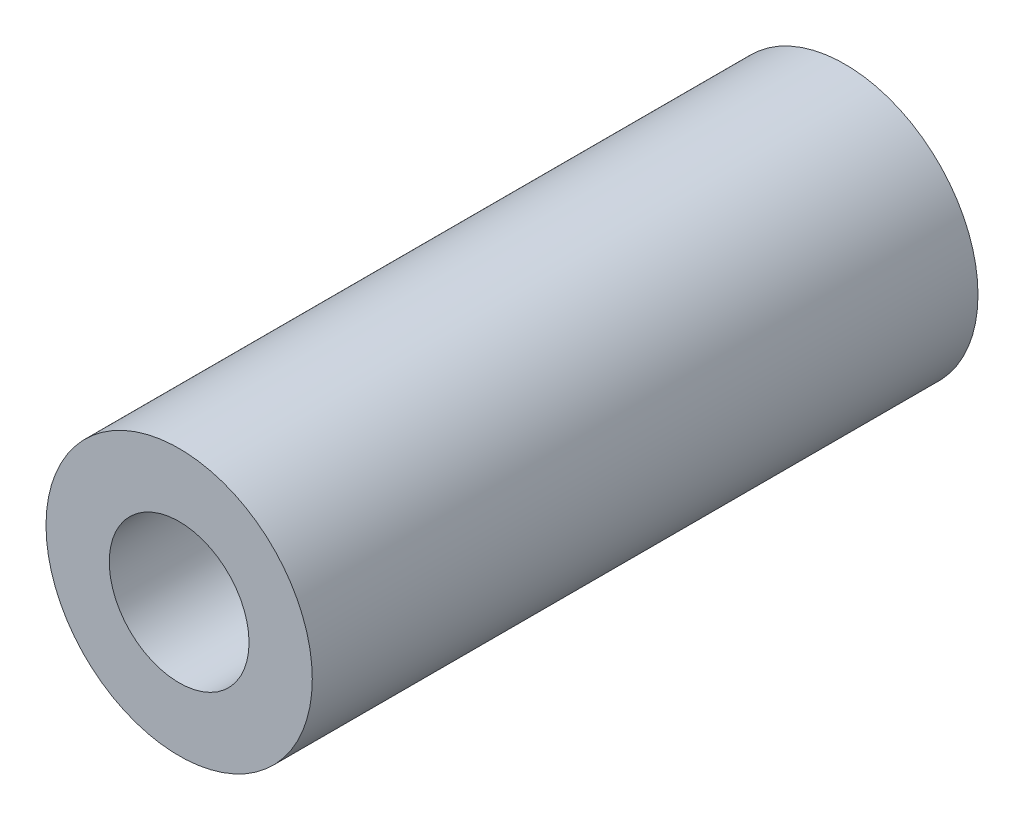
ISO-10303-21;
HEADER;
FILE_DESCRIPTION(('STEP AP214'),'2;1');
FILE_NAME('part.step','',(''),(''),'','','');
FILE_SCHEMA(('AUTOMOTIVE_DESIGN { 1 0 10303 214 1 1 1 1 }'));
ENDSEC;
DATA;
#1=APPLICATION_CONTEXT('core data for automotive mechanical design processes');
#2=APPLICATION_PROTOCOL_DEFINITION('international standard','automotive_design',2000,#1);
#3=PRODUCT_CONTEXT('',#1,'mechanical');
#4=PRODUCT('Part','Part','',(#3));
#5=PRODUCT_RELATED_PRODUCT_CATEGORY('part','',(#4));
#6=PRODUCT_DEFINITION_FORMATION('','',#4);
#7=PRODUCT_DEFINITION_CONTEXT('part definition',#1,'design');
#8=PRODUCT_DEFINITION('design','',#6,#7);
#9=PRODUCT_DEFINITION_SHAPE('','',#8);
#10=(LENGTH_UNIT() NAMED_UNIT(*) SI_UNIT(.MILLI.,.METRE.));
#11=(NAMED_UNIT(*) PLANE_ANGLE_UNIT() SI_UNIT($,.RADIAN.));
#12=(NAMED_UNIT(*) SI_UNIT($,.STERADIAN.) SOLID_ANGLE_UNIT());
#13=UNCERTAINTY_MEASURE_WITH_UNIT(LENGTH_MEASURE(1.E-05),#10,'distance_accuracy_value','');
#14=(GEOMETRIC_REPRESENTATION_CONTEXT(3) GLOBAL_UNCERTAINTY_ASSIGNED_CONTEXT((#13)) GLOBAL_UNIT_ASSIGNED_CONTEXT((#10,
#11,#12)) REPRESENTATION_CONTEXT('',''));
#15=CARTESIAN_POINT('',(0.,0.,0.));
#16=DIRECTION('',(0.,0.,1.));
#17=DIRECTION('',(1.,0.,0.));
#18=AXIS2_PLACEMENT_3D('',#15,#16,#17);
#19=CARTESIAN_POINT('',(0.,0.,10.));
#20=DIRECTION('',(0.,0.,1.));
#21=DIRECTION('',(1.,0.,0.));
#22=AXIS2_PLACEMENT_3D('',#19,#20,#21);
#23=PLANE('',#22);
#24=CARTESIAN_POINT('',(0.,0.,10.));
#25=DIRECTION('',(0.,0.,1.));
#26=DIRECTION('',(1.,0.,0.));
#27=AXIS2_PLACEMENT_3D('',#24,#25,#26);
#28=CIRCLE('',#27,4.);
#29=CARTESIAN_POINT('',(4.,0.,10.));
#30=VERTEX_POINT('',#29);
#31=EDGE_CURVE('E10',#30,#30,#28,.T.);
#32=ORIENTED_EDGE('',*,*,#31,.T.);
#33=EDGE_LOOP('',(#32));
#34=FACE_BOUND('',#33,.T.);
#35=CARTESIAN_POINT('',(0.,0.,10.));
#36=DIRECTION('',(0.,0.,1.));
#37=DIRECTION('',(1.,0.,0.));
#38=AXIS2_PLACEMENT_3D('',#35,#36,#37);
#39=CIRCLE('',#38,2.1);
#40=CARTESIAN_POINT('',(2.1,0.,10.));
#41=VERTEX_POINT('',#40);
#42=EDGE_CURVE('E41',#41,#41,#39,.T.);
#43=ORIENTED_EDGE('',*,*,#42,.F.);
#44=EDGE_LOOP('',(#43));
#45=FACE_BOUND('',#44,.T.);
#46=ADVANCED_FACE('F30',(#34,#45),#23,.T.);
#47=CARTESIAN_POINT('',(0.,0.,-10.));
#48=DIRECTION('',(0.,0.,1.));
#49=DIRECTION('',(1.,0.,0.));
#50=AXIS2_PLACEMENT_3D('',#47,#48,#49);
#51=PLANE('',#50);
#52=CARTESIAN_POINT('',(0.,0.,-10.));
#53=DIRECTION('',(0.,0.,1.));
#54=DIRECTION('',(1.,0.,0.));
#55=AXIS2_PLACEMENT_3D('',#52,#53,#54);
#56=CIRCLE('',#55,4.);
#57=CARTESIAN_POINT('',(4.,0.,-10.));
#58=VERTEX_POINT('',#57);
#59=EDGE_CURVE('E34',#58,#58,#56,.T.);
#60=ORIENTED_EDGE('',*,*,#59,.F.);
#61=EDGE_LOOP('',(#60));
#62=FACE_BOUND('',#61,.T.);
#63=CARTESIAN_POINT('',(0.,0.,-10.));
#64=DIRECTION('',(0.,0.,1.));
#65=DIRECTION('',(1.,0.,0.));
#66=AXIS2_PLACEMENT_3D('',#63,#64,#65);
#67=CIRCLE('',#66,2.1);
#68=CARTESIAN_POINT('',(2.1,0.,-10.));
#69=VERTEX_POINT('',#68);
#70=EDGE_CURVE('E43',#69,#69,#67,.T.);
#71=ORIENTED_EDGE('',*,*,#70,.T.);
#72=EDGE_LOOP('',(#71));
#73=FACE_BOUND('',#72,.T.);
#74=ADVANCED_FACE('F53',(#62,#73),#51,.F.);
#75=CARTESIAN_POINT('',(0.,0.,10.));
#76=DIRECTION('',(0.,0.,-1.));
#77=DIRECTION('',(-1.,0.,0.));
#78=AXIS2_PLACEMENT_3D('',#75,#76,#77);
#79=CYLINDRICAL_SURFACE('',#78,4.);
#80=ORIENTED_EDGE('',*,*,#31,.F.);
#81=EDGE_LOOP('',(#80));
#82=FACE_BOUND('',#81,.T.);
#83=ORIENTED_EDGE('',*,*,#59,.T.);
#84=EDGE_LOOP('',(#83));
#85=FACE_BOUND('',#84,.T.);
#86=ADVANCED_FACE('F32',(#82,#85),#79,.T.);
#87=CARTESIAN_POINT('',(0.,0.,10.));
#88=DIRECTION('',(0.,0.,-1.));
#89=DIRECTION('',(-1.,0.,0.));
#90=AXIS2_PLACEMENT_3D('',#87,#88,#89);
#91=CYLINDRICAL_SURFACE('',#90,2.1);
#92=ORIENTED_EDGE('',*,*,#42,.T.);
#93=EDGE_LOOP('',(#92));
#94=FACE_BOUND('',#93,.T.);
#95=ORIENTED_EDGE('',*,*,#70,.F.);
#96=EDGE_LOOP('',(#95));
#97=FACE_BOUND('',#96,.T.);
#98=ADVANCED_FACE('F49',(#94,#97),#91,.F.);
#99=CLOSED_SHELL('',(#46,#74,#86,#98));
#100=MANIFOLD_SOLID_BREP('B2',#99);
#101=ADVANCED_BREP_SHAPE_REPRESENTATION('',(#18,#100),#14);
#102=SHAPE_DEFINITION_REPRESENTATION(#9,#101);
ENDSEC;
END-ISO-10303-21;
